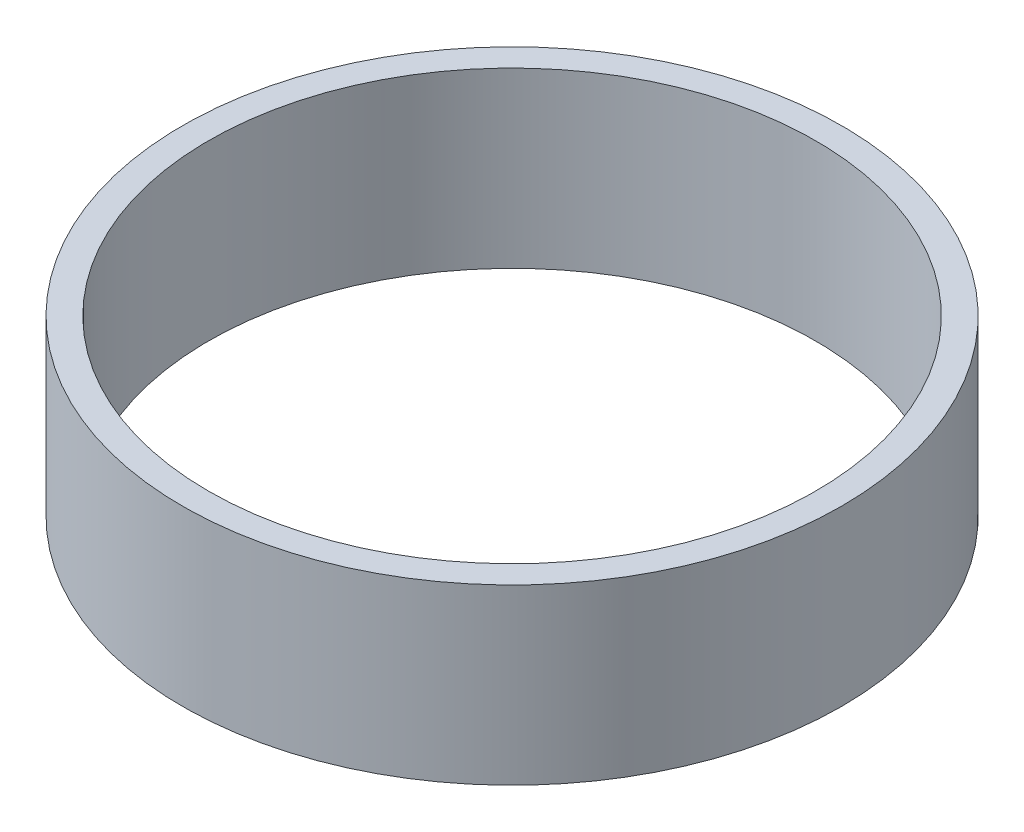
ISO-10303-21;
HEADER;
FILE_DESCRIPTION(('STEP AP214'),'2;1');
FILE_NAME('part.step','',(''),(''),'','','');
FILE_SCHEMA(('AUTOMOTIVE_DESIGN { 1 0 10303 214 1 1 1 1 }'));
ENDSEC;
DATA;
#1=APPLICATION_CONTEXT('core data for automotive mechanical design processes');
#2=APPLICATION_PROTOCOL_DEFINITION('international standard','automotive_design',2000,#1);
#3=PRODUCT_CONTEXT('',#1,'mechanical');
#4=PRODUCT('Part','Part','',(#3));
#5=PRODUCT_RELATED_PRODUCT_CATEGORY('part','',(#4));
#6=PRODUCT_DEFINITION_FORMATION('','',#4);
#7=PRODUCT_DEFINITION_CONTEXT('part definition',#1,'design');
#8=PRODUCT_DEFINITION('design','',#6,#7);
#9=PRODUCT_DEFINITION_SHAPE('','',#8);
#10=(LENGTH_UNIT() NAMED_UNIT(*) SI_UNIT(.MILLI.,.METRE.));
#11=(NAMED_UNIT(*) PLANE_ANGLE_UNIT() SI_UNIT($,.RADIAN.));
#12=(NAMED_UNIT(*) SI_UNIT($,.STERADIAN.) SOLID_ANGLE_UNIT());
#13=UNCERTAINTY_MEASURE_WITH_UNIT(LENGTH_MEASURE(1.E-05),#10,'distance_accuracy_value','');
#14=(GEOMETRIC_REPRESENTATION_CONTEXT(3) GLOBAL_UNCERTAINTY_ASSIGNED_CONTEXT((#13)) GLOBAL_UNIT_ASSIGNED_CONTEXT((#10,
#11,#12)) REPRESENTATION_CONTEXT('',''));
#15=CARTESIAN_POINT('',(0.,0.,0.));
#16=DIRECTION('',(0.,0.,1.));
#17=DIRECTION('',(1.,0.,0.));
#18=AXIS2_PLACEMENT_3D('',#15,#16,#17);
#19=CARTESIAN_POINT('',(0.,20.,0.));
#20=DIRECTION('',(0.,1.,0.));
#21=DIRECTION('',(0.,0.,1.));
#22=AXIS2_PLACEMENT_3D('',#19,#20,#21);
#23=PLANE('',#22);
#24=CARTESIAN_POINT('',(0.,20.,0.));
#25=DIRECTION('',(0.,1.,0.));
#26=DIRECTION('',(1.,0.,0.));
#27=AXIS2_PLACEMENT_3D('',#24,#25,#26);
#28=CIRCLE('',#27,38.);
#29=CARTESIAN_POINT('',(38.,20.,0.));
#30=VERTEX_POINT('',#29);
#31=EDGE_CURVE('E13',#30,#30,#28,.T.);
#32=ORIENTED_EDGE('',*,*,#31,.T.);
#33=EDGE_LOOP('',(#32));
#34=FACE_BOUND('',#33,.T.);
#35=CARTESIAN_POINT('',(0.,20.,0.));
#36=DIRECTION('',(0.,1.,0.));
#37=DIRECTION('',(0.,0.,1.));
#38=AXIS2_PLACEMENT_3D('',#35,#36,#37);
#39=CIRCLE('',#38,35.);
#40=CARTESIAN_POINT('',(0.,20.,35.));
#41=VERTEX_POINT('',#40);
#42=EDGE_CURVE('E66',#41,#41,#39,.T.);
#43=ORIENTED_EDGE('',*,*,#42,.F.);
#44=EDGE_LOOP('',(#43));
#45=FACE_BOUND('',#44,.T.);
#46=ADVANCED_FACE('F53',(#34,#45),#23,.T.);
#47=CARTESIAN_POINT('',(0.,0.,0.));
#48=DIRECTION('',(0.,1.,0.));
#49=DIRECTION('',(0.,0.,1.));
#50=AXIS2_PLACEMENT_3D('',#47,#48,#49);
#51=PLANE('',#50);
#52=CARTESIAN_POINT('',(0.,0.,0.));
#53=DIRECTION('',(0.,1.,0.));
#54=DIRECTION('',(1.,0.,0.));
#55=AXIS2_PLACEMENT_3D('',#52,#53,#54);
#56=CIRCLE('',#55,38.);
#57=CARTESIAN_POINT('',(38.,0.,0.));
#58=VERTEX_POINT('',#57);
#59=EDGE_CURVE('E57',#58,#58,#56,.T.);
#60=ORIENTED_EDGE('',*,*,#59,.F.);
#61=EDGE_LOOP('',(#60));
#62=FACE_BOUND('',#61,.T.);
#63=CARTESIAN_POINT('',(0.,0.,0.));
#64=DIRECTION('',(0.,1.,0.));
#65=DIRECTION('',(0.,0.,1.));
#66=AXIS2_PLACEMENT_3D('',#63,#64,#65);
#67=CIRCLE('',#66,35.);
#68=CARTESIAN_POINT('',(0.,0.,35.));
#69=VERTEX_POINT('',#68);
#70=EDGE_CURVE('E68',#69,#69,#67,.T.);
#71=ORIENTED_EDGE('',*,*,#70,.T.);
#72=EDGE_LOOP('',(#71));
#73=FACE_BOUND('',#72,.T.);
#74=ADVANCED_FACE('F80',(#62,#73),#51,.F.);
#75=CARTESIAN_POINT('',(0.,20.,0.));
#76=DIRECTION('',(0.,-1.,0.));
#77=DIRECTION('',(0.,0.,-1.));
#78=AXIS2_PLACEMENT_3D('',#75,#76,#77);
#79=CYLINDRICAL_SURFACE('',#78,38.);
#80=ORIENTED_EDGE('',*,*,#31,.F.);
#81=EDGE_LOOP('',(#80));
#82=FACE_BOUND('',#81,.T.);
#83=ORIENTED_EDGE('',*,*,#59,.T.);
#84=EDGE_LOOP('',(#83));
#85=FACE_BOUND('',#84,.T.);
#86=ADVANCED_FACE('F55',(#82,#85),#79,.T.);
#87=CARTESIAN_POINT('',(0.,20.,0.));
#88=DIRECTION('',(0.,-1.,0.));
#89=DIRECTION('',(0.,0.,-1.));
#90=AXIS2_PLACEMENT_3D('',#87,#88,#89);
#91=CYLINDRICAL_SURFACE('',#90,35.);
#92=ORIENTED_EDGE('',*,*,#42,.T.);
#93=EDGE_LOOP('',(#92));
#94=FACE_BOUND('',#93,.T.);
#95=ORIENTED_EDGE('',*,*,#70,.F.);
#96=EDGE_LOOP('',(#95));
#97=FACE_BOUND('',#96,.T.);
#98=ADVANCED_FACE('F76',(#94,#97),#91,.F.);
#99=CLOSED_SHELL('',(#46,#74,#86,#98));
#100=MANIFOLD_SOLID_BREP('B2',#99);
#101=ADVANCED_BREP_SHAPE_REPRESENTATION('',(#18,#100),#14);
#102=SHAPE_DEFINITION_REPRESENTATION(#9,#101);
ENDSEC;
END-ISO-10303-21;
